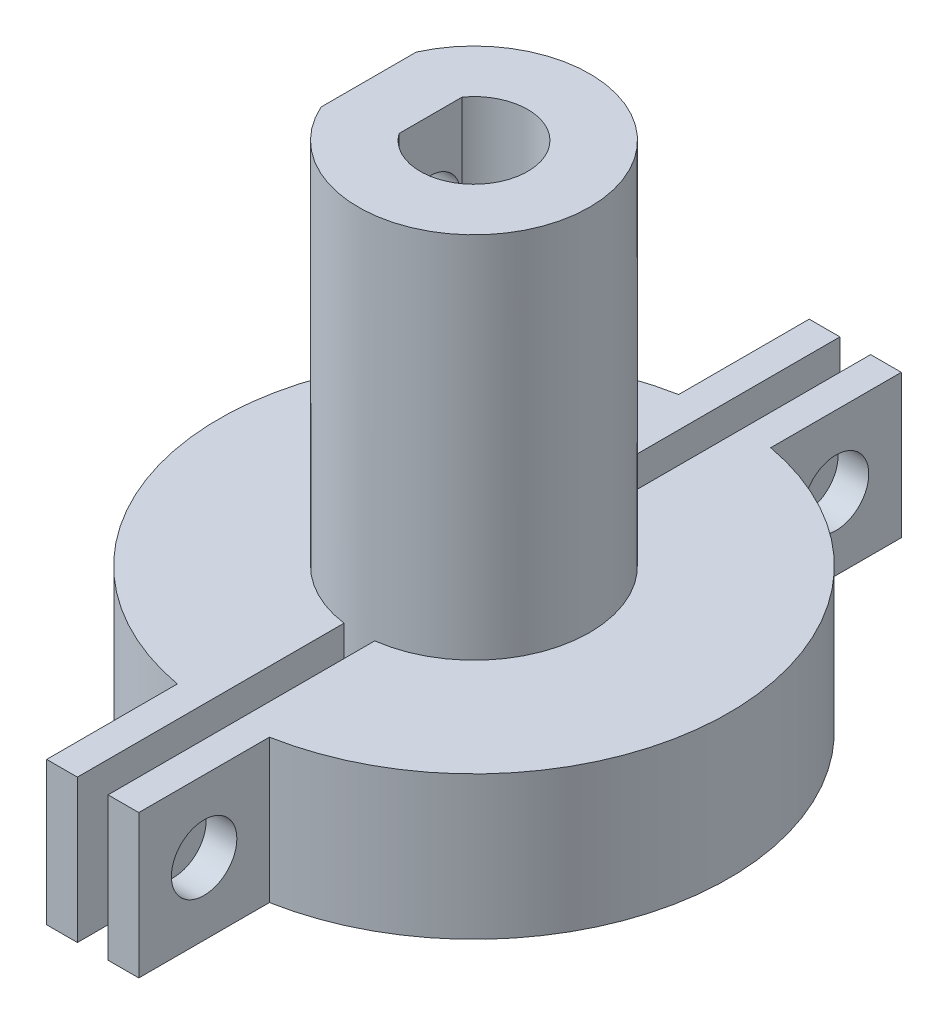
ISO-10303-21;
HEADER;
FILE_DESCRIPTION(('STEP AP214'),'2;1');
FILE_NAME('part.step','',(''),(''),'','','');
FILE_SCHEMA(('AUTOMOTIVE_DESIGN { 1 0 10303 214 1 1 1 1 }'));
ENDSEC;
DATA;
#1=APPLICATION_CONTEXT('core data for automotive mechanical design processes');
#2=APPLICATION_PROTOCOL_DEFINITION('international standard','automotive_design',2000,#1);
#3=PRODUCT_CONTEXT('',#1,'mechanical');
#4=PRODUCT('Part','Part','',(#3));
#5=PRODUCT_RELATED_PRODUCT_CATEGORY('part','',(#4));
#6=PRODUCT_DEFINITION_FORMATION('','',#4);
#7=PRODUCT_DEFINITION_CONTEXT('part definition',#1,'design');
#8=PRODUCT_DEFINITION('design','',#6,#7);
#9=PRODUCT_DEFINITION_SHAPE('','',#8);
#10=(LENGTH_UNIT() NAMED_UNIT(*) SI_UNIT(.MILLI.,.METRE.));
#11=(NAMED_UNIT(*) PLANE_ANGLE_UNIT() SI_UNIT($,.RADIAN.));
#12=(NAMED_UNIT(*) SI_UNIT($,.STERADIAN.) SOLID_ANGLE_UNIT());
#13=UNCERTAINTY_MEASURE_WITH_UNIT(LENGTH_MEASURE(1.E-05),#10,'distance_accuracy_value','');
#14=(GEOMETRIC_REPRESENTATION_CONTEXT(3) GLOBAL_UNCERTAINTY_ASSIGNED_CONTEXT((#13)) GLOBAL_UNIT_ASSIGNED_CONTEXT((#10,
#11,#12)) REPRESENTATION_CONTEXT('',''));
#15=CARTESIAN_POINT('',(0.,0.,0.));
#16=DIRECTION('',(0.,0.,1.));
#17=DIRECTION('',(1.,0.,0.));
#18=AXIS2_PLACEMENT_3D('',#15,#16,#17);
#19=CARTESIAN_POINT('',(0.,0.,0.));
#20=DIRECTION('',(0.,-1.,0.));
#21=DIRECTION('',(0.,0.,-1.));
#22=AXIS2_PLACEMENT_3D('',#19,#20,#21);
#23=PLANE('',#22);
#24=CARTESIAN_POINT('',(0.,0.,0.));
#25=DIRECTION('',(0.,1.,0.));
#26=DIRECTION('',(0.,0.,1.));
#27=AXIS2_PLACEMENT_3D('',#24,#25,#26);
#28=CIRCLE('',#27,5.65);
#29=CARTESIAN_POINT('',(-0.750000000000004,0.,-5.6));
#30=VERTEX_POINT('',#29);
#31=CARTESIAN_POINT('',(-5.14941852602047,0.,-2.32507824467849));
#32=VERTEX_POINT('',#31);
#33=EDGE_CURVE('E237',#30,#32,#28,.T.);
#34=ORIENTED_EDGE('',*,*,#33,.F.);
#35=DIRECTION('',(0.,0.,1.));
#36=VECTOR('',#35,1.);
#37=CARTESIAN_POINT('',(-0.75,0.,-9.42019108086455));
#38=LINE('',#37,#36);
#39=CARTESIAN_POINT('',(-0.75,0.,-18.6273891063248));
#40=VERTEX_POINT('',#39);
#41=EDGE_CURVE('E467',#40,#30,#38,.T.);
#42=ORIENTED_EDGE('',*,*,#41,.F.);
#43=DIRECTION('',(-1.,0.,0.));
#44=VECTOR('',#43,1.);
#45=CARTESIAN_POINT('',(-0.75,0.,-18.6273891063248));
#46=LINE('',#45,#44);
#47=CARTESIAN_POINT('',(-2.25,0.,-18.6273891063248));
#48=VERTEX_POINT('',#47);
#49=EDGE_CURVE('E397',#40,#48,#46,.T.);
#50=ORIENTED_EDGE('',*,*,#49,.T.);
#51=DIRECTION('',(0.,0.,1.));
#52=VECTOR('',#51,1.);
#53=CARTESIAN_POINT('',(-2.25,0.,-18.6273891063248));
#54=LINE('',#53,#52);
#55=CARTESIAN_POINT('',(-2.25,0.,-12.2449989791751));
#56=VERTEX_POINT('',#55);
#57=EDGE_CURVE('E390',#48,#56,#54,.T.);
#58=ORIENTED_EDGE('',*,*,#57,.T.);
#59=CARTESIAN_POINT('',(0.,0.,0.));
#60=DIRECTION('',(0.,-1.,0.));
#61=DIRECTION('',(0.,0.,-1.));
#62=AXIS2_PLACEMENT_3D('',#59,#60,#61);
#63=CIRCLE('',#62,12.45);
#64=CARTESIAN_POINT('',(-2.25,0.,12.2449989791751));
#65=VERTEX_POINT('',#64);
#66=EDGE_CURVE('E65',#65,#56,#63,.T.);
#67=ORIENTED_EDGE('',*,*,#66,.F.);
#68=DIRECTION('',(0.,0.,1.));
#69=VECTOR('',#68,1.);
#70=CARTESIAN_POINT('',(-2.25,0.,18.6273891063248));
#71=LINE('',#70,#69);
#72=CARTESIAN_POINT('',(-2.25,0.,18.6273891063248));
#73=VERTEX_POINT('',#72);
#74=EDGE_CURVE('E447',#65,#73,#71,.T.);
#75=ORIENTED_EDGE('',*,*,#74,.T.);
#76=DIRECTION('',(1.,0.,0.));
#77=VECTOR('',#76,1.);
#78=CARTESIAN_POINT('',(-0.75,0.,18.6273891063248));
#79=LINE('',#78,#77);
#80=CARTESIAN_POINT('',(-0.75,0.,18.6273891063248));
#81=VERTEX_POINT('',#80);
#82=EDGE_CURVE('E444',#73,#81,#79,.T.);
#83=ORIENTED_EDGE('',*,*,#82,.T.);
#84=DIRECTION('',(0.,0.,1.));
#85=VECTOR('',#84,1.);
#86=CARTESIAN_POINT('',(-0.75,0.,9.42019108086455));
#87=LINE('',#86,#85);
#88=CARTESIAN_POINT('',(-0.749999999999999,0.,5.6));
#89=VERTEX_POINT('',#88);
#90=EDGE_CURVE('E328',#89,#81,#87,.T.);
#91=ORIENTED_EDGE('',*,*,#90,.F.);
#92=CARTESIAN_POINT('',(-5.14941852602047,0.,2.32507824467849));
#93=VERTEX_POINT('',#92);
#94=EDGE_CURVE('E236',#93,#89,#28,.T.);
#95=ORIENTED_EDGE('',*,*,#94,.F.);
#96=DIRECTION('',(0.,0.,1.));
#97=VECTOR('',#96,1.);
#98=CARTESIAN_POINT('',(-5.14941852602047,0.,-2.32507824467849));
#99=LINE('',#98,#97);
#100=EDGE_CURVE('E241',#32,#93,#99,.T.);
#101=ORIENTED_EDGE('',*,*,#100,.F.);
#102=EDGE_LOOP('',(#34,#42,#50,#58,#67,#75,#83,#91,#95,#101));
#103=FACE_BOUND('',#102,.T.);
#104=ADVANCED_FACE('F44',(#103),#23,.F.);
#105=CARTESIAN_POINT('',(0.,-2.,0.));
#106=DIRECTION('',(0.,1.,0.));
#107=DIRECTION('',(0.,0.,1.));
#108=AXIS2_PLACEMENT_3D('',#105,#106,#107);
#109=CYLINDRICAL_SURFACE('',#108,12.45);
#110=ORIENTED_EDGE('',*,*,#66,.T.);
#111=DIRECTION('',(0.,-1.,0.));
#112=VECTOR('',#111,1.);
#113=CARTESIAN_POINT('',(-2.25,6.55628734385074,-12.2449989791751));
#114=LINE('',#113,#112);
#115=CARTESIAN_POINT('',(-2.25,-7.,-12.2449989791751));
#116=VERTEX_POINT('',#115);
#117=EDGE_CURVE('E60',#56,#116,#114,.T.);
#118=ORIENTED_EDGE('',*,*,#117,.T.);
#119=CARTESIAN_POINT('',(0.,-7.,0.));
#120=DIRECTION('',(0.,-1.,0.));
#121=DIRECTION('',(0.,0.,-1.));
#122=AXIS2_PLACEMENT_3D('',#119,#120,#121);
#123=CIRCLE('',#122,12.45);
#124=CARTESIAN_POINT('',(-2.25,-7.,12.2449989791751));
#125=VERTEX_POINT('',#124);
#126=EDGE_CURVE('E517',#125,#116,#123,.T.);
#127=ORIENTED_EDGE('',*,*,#126,.F.);
#128=DIRECTION('',(0.,-1.,0.));
#129=VECTOR('',#128,1.);
#130=CARTESIAN_POINT('',(-2.25,6.55628734385074,12.2449989791751));
#131=LINE('',#130,#129);
#132=EDGE_CURVE('E448',#65,#125,#131,.T.);
#133=ORIENTED_EDGE('',*,*,#132,.F.);
#134=EDGE_LOOP('',(#110,#118,#127,#133));
#135=FACE_BOUND('',#134,.T.);
#136=ADVANCED_FACE('F585',(#135),#109,.T.);
#137=CARTESIAN_POINT('',(0.,-7.,0.));
#138=DIRECTION('',(0.,-1.,0.));
#139=DIRECTION('',(0.,0.,-1.));
#140=AXIS2_PLACEMENT_3D('',#137,#138,#139);
#141=PLANE('',#140);
#142=DIRECTION('',(0.,0.,-1.));
#143=VECTOR('',#142,1.);
#144=CARTESIAN_POINT('',(-0.75,-7.,-9.42019108086455));
#145=LINE('',#144,#143);
#146=CARTESIAN_POINT('',(-0.750000000000005,-7.,-9.42019108086455));
#147=VERTEX_POINT('',#146);
#148=CARTESIAN_POINT('',(-0.75,-7.,-18.6273891063248));
#149=VERTEX_POINT('',#148);
#150=EDGE_CURVE('E474',#147,#149,#145,.T.);
#151=ORIENTED_EDGE('',*,*,#150,.F.);
#152=CARTESIAN_POINT('',(0.,-7.,0.));
#153=DIRECTION('',(0.,-1.,0.));
#154=DIRECTION('',(0.,0.,-1.));
#155=AXIS2_PLACEMENT_3D('',#152,#153,#154);
#156=CIRCLE('',#155,9.45);
#157=CARTESIAN_POINT('',(-0.749999999999998,-7.,9.42019108086455));
#158=VERTEX_POINT('',#157);
#159=EDGE_CURVE('E503',#158,#147,#156,.T.);
#160=ORIENTED_EDGE('',*,*,#159,.F.);
#161=DIRECTION('',(0.,0.,-1.));
#162=VECTOR('',#161,1.);
#163=CARTESIAN_POINT('',(-0.75,-7.,9.42019108086455));
#164=LINE('',#163,#162);
#165=CARTESIAN_POINT('',(-0.75,-7.,18.6273891063248));
#166=VERTEX_POINT('',#165);
#167=EDGE_CURVE('E494',#166,#158,#164,.T.);
#168=ORIENTED_EDGE('',*,*,#167,.F.);
#169=DIRECTION('',(-1.,0.,0.));
#170=VECTOR('',#169,1.);
#171=CARTESIAN_POINT('',(-0.75,-7.,18.6273891063248));
#172=LINE('',#171,#170);
#173=CARTESIAN_POINT('',(-2.25,-7.,18.6273891063248));
#174=VERTEX_POINT('',#173);
#175=EDGE_CURVE('E441',#166,#174,#172,.T.);
#176=ORIENTED_EDGE('',*,*,#175,.T.);
#177=DIRECTION('',(0.,0.,-1.));
#178=VECTOR('',#177,1.);
#179=CARTESIAN_POINT('',(-2.25,-7.,18.6273891063248));
#180=LINE('',#179,#178);
#181=EDGE_CURVE('E454',#174,#125,#180,.T.);
#182=ORIENTED_EDGE('',*,*,#181,.T.);
#183=ORIENTED_EDGE('',*,*,#126,.T.);
#184=DIRECTION('',(0.,0.,-1.));
#185=VECTOR('',#184,1.);
#186=CARTESIAN_POINT('',(-2.25,-7.,-18.6273891063248));
#187=LINE('',#186,#185);
#188=CARTESIAN_POINT('',(-2.25,-7.,-18.6273891063248));
#189=VERTEX_POINT('',#188);
#190=EDGE_CURVE('E411',#116,#189,#187,.T.);
#191=ORIENTED_EDGE('',*,*,#190,.T.);
#192=DIRECTION('',(1.,0.,0.));
#193=VECTOR('',#192,1.);
#194=CARTESIAN_POINT('',(-0.75,-7.,-18.6273891063248));
#195=LINE('',#194,#193);
#196=EDGE_CURVE('E400',#189,#149,#195,.T.);
#197=ORIENTED_EDGE('',*,*,#196,.T.);
#198=EDGE_LOOP('',(#151,#160,#168,#176,#182,#183,#191,#197));
#199=FACE_BOUND('',#198,.T.);
#200=ADVANCED_FACE('F527',(#199),#141,.T.);
#201=CARTESIAN_POINT('',(0.,-7.,0.));
#202=DIRECTION('',(0.,1.,0.));
#203=DIRECTION('',(0.,0.,1.));
#204=AXIS2_PLACEMENT_3D('',#201,#202,#203);
#205=CYLINDRICAL_SURFACE('',#204,9.45);
#206=DIRECTION('',(0.,-1.,0.));
#207=VECTOR('',#206,1.);
#208=CARTESIAN_POINT('',(-0.750000000000005,18.001,-9.42019108086455));
#209=LINE('',#208,#207);
#210=CARTESIAN_POINT('',(-0.750000000000005,-2.,-9.42019108086455));
#211=VERTEX_POINT('',#210);
#212=EDGE_CURVE('E218',#211,#147,#209,.T.);
#213=ORIENTED_EDGE('',*,*,#212,.F.);
#214=CARTESIAN_POINT('',(0.,-2.,0.));
#215=DIRECTION('',(0.,-1.,0.));
#216=DIRECTION('',(0.,0.,-1.));
#217=AXIS2_PLACEMENT_3D('',#214,#215,#216);
#218=CIRCLE('',#217,9.45);
#219=CARTESIAN_POINT('',(-0.749999999999998,-2.,9.42019108086455));
#220=VERTEX_POINT('',#219);
#221=EDGE_CURVE('E272',#211,#220,#218,.F.);
#222=ORIENTED_EDGE('',*,*,#221,.T.);
#223=DIRECTION('',(0.,-1.,0.));
#224=VECTOR('',#223,1.);
#225=CARTESIAN_POINT('',(-0.749999999999998,18.001,9.42019108086455));
#226=LINE('',#225,#224);
#227=EDGE_CURVE('E486',#220,#158,#226,.T.);
#228=ORIENTED_EDGE('',*,*,#227,.T.);
#229=ORIENTED_EDGE('',*,*,#159,.T.);
#230=EDGE_LOOP('',(#213,#222,#228,#229));
#231=FACE_BOUND('',#230,.T.);
#232=ADVANCED_FACE('F524',(#231),#205,.F.);
#233=CARTESIAN_POINT('',(0.,18.,0.));
#234=DIRECTION('',(0.,1.,0.));
#235=DIRECTION('',(0.,0.,1.));
#236=AXIS2_PLACEMENT_3D('',#233,#234,#235);
#237=PLANE('',#236);
#238=CARTESIAN_POINT('',(0.,18.,0.));
#239=DIRECTION('',(0.,1.,0.));
#240=DIRECTION('',(0.,0.,1.));
#241=AXIS2_PLACEMENT_3D('',#238,#239,#240);
#242=CIRCLE('',#241,5.65);
#243=CARTESIAN_POINT('',(-5.14941852602047,18.,2.32507824467849));
#244=VERTEX_POINT('',#243);
#245=CARTESIAN_POINT('',(-5.14941852602047,18.,-2.32507824467849));
#246=VERTEX_POINT('',#245);
#247=EDGE_CURVE('E250',#244,#246,#242,.T.);
#248=ORIENTED_EDGE('',*,*,#247,.T.);
#249=DIRECTION('',(0.,0.,1.));
#250=VECTOR('',#249,1.);
#251=CARTESIAN_POINT('',(-5.14941852602047,18.,-2.32507824467849));
#252=LINE('',#251,#250);
#253=EDGE_CURVE('E245',#246,#244,#252,.T.);
#254=ORIENTED_EDGE('',*,*,#253,.T.);
#255=EDGE_LOOP('',(#248,#254));
#256=FACE_BOUND('',#255,.T.);
#257=DIRECTION('',(0.,0.,1.));
#258=VECTOR('',#257,1.);
#259=CARTESIAN_POINT('',(-2.12441852602047,18.,-1.54190496668926));
#260=LINE('',#259,#258);
#261=CARTESIAN_POINT('',(-2.12441852602047,18.,-1.54190496668926));
#262=VERTEX_POINT('',#261);
#263=CARTESIAN_POINT('',(-2.12441852602047,18.,1.54190496668926));
#264=VERTEX_POINT('',#263);
#265=EDGE_CURVE('E296',#262,#264,#260,.T.);
#266=ORIENTED_EDGE('',*,*,#265,.F.);
#267=CARTESIAN_POINT('',(0.,18.,0.));
#268=DIRECTION('',(0.,1.,0.));
#269=DIRECTION('',(0.,0.,1.));
#270=AXIS2_PLACEMENT_3D('',#267,#268,#269);
#271=CIRCLE('',#270,2.625);
#272=EDGE_CURVE('E292',#264,#262,#271,.T.);
#273=ORIENTED_EDGE('',*,*,#272,.F.);
#274=EDGE_LOOP('',(#266,#273));
#275=FACE_BOUND('',#274,.T.);
#276=ADVANCED_FACE('F318',(#256,#275),#237,.T.);
#277=CARTESIAN_POINT('',(0.,18.,0.));
#278=DIRECTION('',(0.,-1.,0.));
#279=DIRECTION('',(0.,0.,-1.));
#280=AXIS2_PLACEMENT_3D('',#277,#278,#279);
#281=CYLINDRICAL_SURFACE('',#280,5.65);
#282=ORIENTED_EDGE('',*,*,#94,.T.);
#283=DIRECTION('',(0.,1.,0.));
#284=VECTOR('',#283,1.);
#285=CARTESIAN_POINT('',(-0.749999999999999,-7.,5.6));
#286=LINE('',#285,#284);
#287=CARTESIAN_POINT('',(-0.749999999999999,-2.,5.6));
#288=VERTEX_POINT('',#287);
#289=EDGE_CURVE('E229',#288,#89,#286,.T.);
#290=ORIENTED_EDGE('',*,*,#289,.F.);
#291=CARTESIAN_POINT('',(0.,-2.,0.));
#292=DIRECTION('',(0.,-1.,0.));
#293=DIRECTION('',(0.,0.,-1.));
#294=AXIS2_PLACEMENT_3D('',#291,#292,#293);
#295=CIRCLE('',#294,5.65);
#296=CARTESIAN_POINT('',(0.75,-2.,5.6));
#297=VERTEX_POINT('',#296);
#298=EDGE_CURVE('E53',#288,#297,#295,.F.);
#299=ORIENTED_EDGE('',*,*,#298,.T.);
#300=DIRECTION('',(0.,1.,0.));
#301=VECTOR('',#300,1.);
#302=CARTESIAN_POINT('',(0.75,-7.,5.6));
#303=LINE('',#302,#301);
#304=CARTESIAN_POINT('',(0.75,0.,5.6));
#305=VERTEX_POINT('',#304);
#306=EDGE_CURVE('E234',#297,#305,#303,.T.);
#307=ORIENTED_EDGE('',*,*,#306,.T.);
#308=CARTESIAN_POINT('',(0.75,0.,-5.6));
#309=VERTEX_POINT('',#308);
#310=EDGE_CURVE('E210',#305,#309,#28,.T.);
#311=ORIENTED_EDGE('',*,*,#310,.T.);
#312=DIRECTION('',(0.,1.,0.));
#313=VECTOR('',#312,1.);
#314=CARTESIAN_POINT('',(0.75,-7.,-5.6));
#315=LINE('',#314,#313);
#316=CARTESIAN_POINT('',(0.75,-2.,-5.6));
#317=VERTEX_POINT('',#316);
#318=EDGE_CURVE('E221',#317,#309,#315,.T.);
#319=ORIENTED_EDGE('',*,*,#318,.F.);
#320=CARTESIAN_POINT('',(0.,-2.,0.));
#321=DIRECTION('',(0.,-1.,0.));
#322=DIRECTION('',(0.,0.,-1.));
#323=AXIS2_PLACEMENT_3D('',#320,#321,#322);
#324=CIRCLE('',#323,5.65);
#325=CARTESIAN_POINT('',(-0.750000000000004,-2.,-5.6));
#326=VERTEX_POINT('',#325);
#327=EDGE_CURVE('E11',#317,#326,#324,.F.);
#328=ORIENTED_EDGE('',*,*,#327,.T.);
#329=DIRECTION('',(0.,1.,0.));
#330=VECTOR('',#329,1.);
#331=CARTESIAN_POINT('',(-0.750000000000004,-7.,-5.6));
#332=LINE('',#331,#330);
#333=EDGE_CURVE('E228',#326,#30,#332,.T.);
#334=ORIENTED_EDGE('',*,*,#333,.T.);
#335=ORIENTED_EDGE('',*,*,#33,.T.);
#336=DIRECTION('',(0.,-1.,0.));
#337=VECTOR('',#336,1.);
#338=CARTESIAN_POINT('',(-5.14941852602047,18.,-2.32507824467849));
#339=LINE('',#338,#337);
#340=EDGE_CURVE('E255',#246,#32,#339,.T.);
#341=ORIENTED_EDGE('',*,*,#340,.F.);
#342=ORIENTED_EDGE('',*,*,#247,.F.);
#343=DIRECTION('',(0.,-1.,0.));
#344=VECTOR('',#343,1.);
#345=CARTESIAN_POINT('',(-5.14941852602047,18.,2.32507824467849));
#346=LINE('',#345,#344);
#347=EDGE_CURVE('E251',#244,#93,#346,.T.);
#348=ORIENTED_EDGE('',*,*,#347,.T.);
#349=EDGE_LOOP('',(#282,#290,#299,#307,#311,#319,#328,#334,#335,#341,#342,#348));
#350=FACE_BOUND('',#349,.T.);
#351=ADVANCED_FACE('F46',(#350),#281,.T.);
#352=CARTESIAN_POINT('',(-5.14941852602047,18.,-2.32507824467849));
#353=DIRECTION('',(1.,0.,0.));
#354=DIRECTION('',(0.,0.,-1.));
#355=AXIS2_PLACEMENT_3D('',#352,#353,#354);
#356=PLANE('',#355);
#357=CARTESIAN_POINT('',(-5.14941852602047,14.,0.));
#358=DIRECTION('',(-1.,0.,0.));
#359=DIRECTION('',(0.,0.,1.));
#360=AXIS2_PLACEMENT_3D('',#357,#358,#359);
#361=CIRCLE('',#360,1.45);
#362=CARTESIAN_POINT('',(-5.14941852602047,14.,1.45));
#363=VERTEX_POINT('',#362);
#364=EDGE_CURVE('E499',#363,#363,#361,.T.);
#365=ORIENTED_EDGE('',*,*,#364,.F.);
#366=EDGE_LOOP('',(#365));
#367=FACE_BOUND('',#366,.T.);
#368=CARTESIAN_POINT('',(-5.14941852602047,4.,0.));
#369=DIRECTION('',(-1.,0.,0.));
#370=DIRECTION('',(0.,0.,1.));
#371=AXIS2_PLACEMENT_3D('',#368,#369,#370);
#372=CIRCLE('',#371,1.45);
#373=CARTESIAN_POINT('',(-5.14941852602047,4.,1.45));
#374=VERTEX_POINT('',#373);
#375=EDGE_CURVE('E217',#374,#374,#372,.T.);
#376=ORIENTED_EDGE('',*,*,#375,.F.);
#377=EDGE_LOOP('',(#376));
#378=FACE_BOUND('',#377,.T.);
#379=ORIENTED_EDGE('',*,*,#100,.T.);
#380=ORIENTED_EDGE('',*,*,#347,.F.);
#381=ORIENTED_EDGE('',*,*,#253,.F.);
#382=ORIENTED_EDGE('',*,*,#340,.T.);
#383=EDGE_LOOP('',(#379,#380,#381,#382));
#384=FACE_BOUND('',#383,.T.);
#385=ADVANCED_FACE('F321',(#367,#378,#384),#356,.F.);
#386=CARTESIAN_POINT('',(0.,18.,0.));
#387=DIRECTION('',(0.,-1.,0.));
#388=DIRECTION('',(0.,0.,-1.));
#389=AXIS2_PLACEMENT_3D('',#386,#387,#388);
#390=CYLINDRICAL_SURFACE('',#389,2.625);
#391=CARTESIAN_POINT('',(0.,0.,0.));
#392=DIRECTION('',(0.,1.,0.));
#393=DIRECTION('',(0.,0.,1.));
#394=AXIS2_PLACEMENT_3D('',#391,#392,#393);
#395=CIRCLE('',#394,2.625);
#396=CARTESIAN_POINT('',(-2.12441852602047,0.,1.54190496668926));
#397=VERTEX_POINT('',#396);
#398=CARTESIAN_POINT('',(-2.12441852602047,0.,-1.54190496668926));
#399=VERTEX_POINT('',#398);
#400=EDGE_CURVE('E291',#397,#399,#395,.T.);
#401=ORIENTED_EDGE('',*,*,#400,.F.);
#402=DIRECTION('',(0.,-1.,0.));
#403=VECTOR('',#402,1.);
#404=CARTESIAN_POINT('',(-2.12441852602047,18.,1.54190496668926));
#405=LINE('',#404,#403);
#406=EDGE_CURVE('E300',#264,#397,#405,.T.);
#407=ORIENTED_EDGE('',*,*,#406,.F.);
#408=ORIENTED_EDGE('',*,*,#272,.T.);
#409=DIRECTION('',(0.,-1.,0.));
#410=VECTOR('',#409,1.);
#411=CARTESIAN_POINT('',(-2.12441852602047,18.,-1.54190496668926));
#412=LINE('',#411,#410);
#413=EDGE_CURVE('E242',#262,#399,#412,.T.);
#414=ORIENTED_EDGE('',*,*,#413,.T.);
#415=EDGE_LOOP('',(#401,#407,#408,#414));
#416=FACE_BOUND('',#415,.T.);
#417=ADVANCED_FACE('F612',(#416),#390,.F.);
#418=CARTESIAN_POINT('',(-2.12441852602047,18.,-1.54190496668926));
#419=DIRECTION('',(1.,0.,0.));
#420=DIRECTION('',(0.,0.,-1.));
#421=AXIS2_PLACEMENT_3D('',#418,#419,#420);
#422=PLANE('',#421);
#423=CARTESIAN_POINT('',(-2.12441852602047,14.,0.));
#424=DIRECTION('',(1.,0.,0.));
#425=DIRECTION('',(0.,0.,-1.));
#426=AXIS2_PLACEMENT_3D('',#423,#424,#425);
#427=CIRCLE('',#426,1.45);
#428=CARTESIAN_POINT('',(-2.12441852602047,14.,-1.45));
#429=VERTEX_POINT('',#428);
#430=EDGE_CURVE('E504',#429,#429,#427,.F.);
#431=ORIENTED_EDGE('',*,*,#430,.T.);
#432=EDGE_LOOP('',(#431));
#433=FACE_BOUND('',#432,.T.);
#434=CARTESIAN_POINT('',(-2.12441852602047,4.,0.));
#435=DIRECTION('',(1.,0.,0.));
#436=DIRECTION('',(0.,0.,-1.));
#437=AXIS2_PLACEMENT_3D('',#434,#435,#436);
#438=CIRCLE('',#437,1.45);
#439=CARTESIAN_POINT('',(-2.12441852602047,4.,-1.45));
#440=VERTEX_POINT('',#439);
#441=EDGE_CURVE('E508',#440,#440,#438,.F.);
#442=ORIENTED_EDGE('',*,*,#441,.T.);
#443=EDGE_LOOP('',(#442));
#444=FACE_BOUND('',#443,.T.);
#445=DIRECTION('',(0.,0.,1.));
#446=VECTOR('',#445,1.);
#447=CARTESIAN_POINT('',(-2.12441852602047,0.,-1.54190496668926));
#448=LINE('',#447,#446);
#449=EDGE_CURVE('E297',#399,#397,#448,.T.);
#450=ORIENTED_EDGE('',*,*,#449,.F.);
#451=ORIENTED_EDGE('',*,*,#413,.F.);
#452=ORIENTED_EDGE('',*,*,#265,.T.);
#453=ORIENTED_EDGE('',*,*,#406,.T.);
#454=EDGE_LOOP('',(#450,#451,#452,#453));
#455=FACE_BOUND('',#454,.T.);
#456=ADVANCED_FACE('F596',(#433,#444,#455),#422,.T.);
#457=ORIENTED_EDGE('',*,*,#449,.T.);
#458=ORIENTED_EDGE('',*,*,#400,.T.);
#459=EDGE_LOOP('',(#457,#458));
#460=FACE_BOUND('',#459,.T.);
#461=ADVANCED_FACE('F587',(#460),#23,.F.);
#462=CARTESIAN_POINT('',(2.25000000000001,-7.,-12.2449989791751));
#463=VERTEX_POINT('',#462);
#464=CARTESIAN_POINT('',(2.25000000000001,-7.,12.2449989791751));
#465=VERTEX_POINT('',#464);
#466=EDGE_CURVE('E286',#463,#465,#123,.T.);
#467=ORIENTED_EDGE('',*,*,#466,.F.);
#468=DIRECTION('',(0.,-1.,0.));
#469=VECTOR('',#468,1.);
#470=CARTESIAN_POINT('',(2.25000000000001,6.55628734385074,-12.2449989791751));
#471=LINE('',#470,#469);
#472=CARTESIAN_POINT('',(2.25000000000001,0.,-12.2449989791751));
#473=VERTEX_POINT('',#472);
#474=EDGE_CURVE('E380',#473,#463,#471,.T.);
#475=ORIENTED_EDGE('',*,*,#474,.F.);
#476=CARTESIAN_POINT('',(2.25000000000001,0.,12.2449989791751));
#477=VERTEX_POINT('',#476);
#478=EDGE_CURVE('E288',#473,#477,#63,.T.);
#479=ORIENTED_EDGE('',*,*,#478,.T.);
#480=DIRECTION('',(0.,-1.,0.));
#481=VECTOR('',#480,1.);
#482=CARTESIAN_POINT('',(2.25000000000001,6.55628734385074,12.2449989791751));
#483=LINE('',#482,#481);
#484=EDGE_CURVE('E422',#477,#465,#483,.T.);
#485=ORIENTED_EDGE('',*,*,#484,.T.);
#486=EDGE_LOOP('',(#467,#475,#479,#485));
#487=FACE_BOUND('',#486,.T.);
#488=ADVANCED_FACE('F559',(#487),#109,.T.);
#489=DIRECTION('',(0.,0.,-1.));
#490=VECTOR('',#489,1.);
#491=CARTESIAN_POINT('',(0.75,0.,-9.42019108086455));
#492=LINE('',#491,#490);
#493=CARTESIAN_POINT('',(0.75000000000001,0.,-18.6273891063248));
#494=VERTEX_POINT('',#493);
#495=EDGE_CURVE('E206',#309,#494,#492,.T.);
#496=ORIENTED_EDGE('',*,*,#495,.F.);
#497=ORIENTED_EDGE('',*,*,#310,.F.);
#498=DIRECTION('',(0.,0.,-1.));
#499=VECTOR('',#498,1.);
#500=CARTESIAN_POINT('',(0.75,0.,9.42019108086455));
#501=LINE('',#500,#499);
#502=CARTESIAN_POINT('',(0.75000000000001,0.,18.6273891063248));
#503=VERTEX_POINT('',#502);
#504=EDGE_CURVE('E471',#503,#305,#501,.T.);
#505=ORIENTED_EDGE('',*,*,#504,.F.);
#506=DIRECTION('',(1.,0.,0.));
#507=VECTOR('',#506,1.);
#508=CARTESIAN_POINT('',(0.75000000000001,0.,18.6273891063248));
#509=LINE('',#508,#507);
#510=CARTESIAN_POINT('',(2.25000000000001,0.,18.6273891063248));
#511=VERTEX_POINT('',#510);
#512=EDGE_CURVE('E421',#503,#511,#509,.T.);
#513=ORIENTED_EDGE('',*,*,#512,.T.);
#514=DIRECTION('',(0.,0.,-1.));
#515=VECTOR('',#514,1.);
#516=CARTESIAN_POINT('',(2.25000000000001,0.,18.6273891063248));
#517=LINE('',#516,#515);
#518=EDGE_CURVE('E415',#511,#477,#517,.T.);
#519=ORIENTED_EDGE('',*,*,#518,.T.);
#520=ORIENTED_EDGE('',*,*,#478,.F.);
#521=DIRECTION('',(0.,0.,-1.));
#522=VECTOR('',#521,1.);
#523=CARTESIAN_POINT('',(2.25000000000001,0.,-18.6273891063248));
#524=LINE('',#523,#522);
#525=CARTESIAN_POINT('',(2.25000000000001,0.,-18.6273891063248));
#526=VERTEX_POINT('',#525);
#527=EDGE_CURVE('E372',#473,#526,#524,.T.);
#528=ORIENTED_EDGE('',*,*,#527,.T.);
#529=DIRECTION('',(-1.,0.,0.));
#530=VECTOR('',#529,1.);
#531=CARTESIAN_POINT('',(0.75000000000001,0.,-18.6273891063248));
#532=LINE('',#531,#530);
#533=EDGE_CURVE('E212',#526,#494,#532,.T.);
#534=ORIENTED_EDGE('',*,*,#533,.T.);
#535=EDGE_LOOP('',(#496,#497,#505,#513,#519,#520,#528,#534));
#536=FACE_BOUND('',#535,.T.);
#537=ADVANCED_FACE('F208',(#536),#23,.F.);
#538=DIRECTION('',(0.,0.,1.));
#539=VECTOR('',#538,1.);
#540=CARTESIAN_POINT('',(0.75,-7.,-9.42019108086455));
#541=LINE('',#540,#539);
#542=CARTESIAN_POINT('',(0.75000000000001,-7.,-18.6273891063248));
#543=VERTEX_POINT('',#542);
#544=CARTESIAN_POINT('',(0.75,-7.,-9.42019108086455));
#545=VERTEX_POINT('',#544);
#546=EDGE_CURVE('E470',#543,#545,#541,.T.);
#547=ORIENTED_EDGE('',*,*,#546,.F.);
#548=DIRECTION('',(1.,0.,0.));
#549=VECTOR('',#548,1.);
#550=CARTESIAN_POINT('',(0.75000000000001,-7.,-18.6273891063248));
#551=LINE('',#550,#549);
#552=CARTESIAN_POINT('',(2.25000000000001,-7.,-18.6273891063248));
#553=VERTEX_POINT('',#552);
#554=EDGE_CURVE('E386',#543,#553,#551,.T.);
#555=ORIENTED_EDGE('',*,*,#554,.T.);
#556=DIRECTION('',(0.,0.,1.));
#557=VECTOR('',#556,1.);
#558=CARTESIAN_POINT('',(2.25000000000001,-7.,-18.6273891063248));
#559=LINE('',#558,#557);
#560=EDGE_CURVE('E376',#553,#463,#559,.T.);
#561=ORIENTED_EDGE('',*,*,#560,.T.);
#562=ORIENTED_EDGE('',*,*,#466,.T.);
#563=DIRECTION('',(0.,0.,1.));
#564=VECTOR('',#563,1.);
#565=CARTESIAN_POINT('',(2.25000000000001,-7.,18.6273891063248));
#566=LINE('',#565,#564);
#567=CARTESIAN_POINT('',(2.25000000000001,-7.,18.6273891063248));
#568=VERTEX_POINT('',#567);
#569=EDGE_CURVE('E437',#465,#568,#566,.T.);
#570=ORIENTED_EDGE('',*,*,#569,.T.);
#571=DIRECTION('',(-1.,0.,0.));
#572=VECTOR('',#571,1.);
#573=CARTESIAN_POINT('',(0.75000000000001,-7.,18.6273891063248));
#574=LINE('',#573,#572);
#575=CARTESIAN_POINT('',(0.75000000000001,-7.,18.6273891063248));
#576=VERTEX_POINT('',#575);
#577=EDGE_CURVE('E426',#568,#576,#574,.T.);
#578=ORIENTED_EDGE('',*,*,#577,.T.);
#579=DIRECTION('',(0.,0.,1.));
#580=VECTOR('',#579,1.);
#581=CARTESIAN_POINT('',(0.75,-7.,9.42019108086455));
#582=LINE('',#581,#580);
#583=CARTESIAN_POINT('',(0.75,-7.,9.42019108086455));
#584=VERTEX_POINT('',#583);
#585=EDGE_CURVE('E489',#584,#576,#582,.T.);
#586=ORIENTED_EDGE('',*,*,#585,.F.);
#587=EDGE_CURVE('E514',#545,#584,#156,.T.);
#588=ORIENTED_EDGE('',*,*,#587,.F.);
#589=EDGE_LOOP('',(#547,#555,#561,#562,#570,#578,#586,#588));
#590=FACE_BOUND('',#589,.T.);
#591=ADVANCED_FACE('F545',(#590),#141,.T.);
#592=DIRECTION('',(0.,-1.,0.));
#593=VECTOR('',#592,1.);
#594=CARTESIAN_POINT('',(0.75,18.001,-9.42019108086455));
#595=LINE('',#594,#593);
#596=CARTESIAN_POINT('',(0.75,-2.,-9.42019108086455));
#597=VERTEX_POINT('',#596);
#598=EDGE_CURVE('E477',#597,#545,#595,.T.);
#599=ORIENTED_EDGE('',*,*,#598,.T.);
#600=ORIENTED_EDGE('',*,*,#587,.T.);
#601=DIRECTION('',(0.,-1.,0.));
#602=VECTOR('',#601,1.);
#603=CARTESIAN_POINT('',(0.75,18.001,9.42019108086455));
#604=LINE('',#603,#602);
#605=CARTESIAN_POINT('',(0.75,-2.,9.42019108086455));
#606=VERTEX_POINT('',#605);
#607=EDGE_CURVE('E485',#606,#584,#604,.T.);
#608=ORIENTED_EDGE('',*,*,#607,.F.);
#609=EDGE_CURVE('E259',#606,#597,#218,.F.);
#610=ORIENTED_EDGE('',*,*,#609,.T.);
#611=EDGE_LOOP('',(#599,#600,#608,#610));
#612=FACE_BOUND('',#611,.T.);
#613=ADVANCED_FACE('F540',(#612),#205,.F.);
#614=CARTESIAN_POINT('',(0.,-2.,0.));
#615=DIRECTION('',(0.,-1.,0.));
#616=DIRECTION('',(0.,0.,-1.));
#617=AXIS2_PLACEMENT_3D('',#614,#615,#616);
#618=PLANE('',#617);
#619=DIRECTION('',(0.,0.,-1.));
#620=VECTOR('',#619,1.);
#621=CARTESIAN_POINT('',(-0.750000000000001,-2.,0.));
#622=LINE('',#621,#620);
#623=EDGE_CURVE('E344',#326,#211,#622,.T.);
#624=ORIENTED_EDGE('',*,*,#623,.F.);
#625=ORIENTED_EDGE('',*,*,#327,.F.);
#626=DIRECTION('',(0.,0.,1.));
#627=VECTOR('',#626,1.);
#628=CARTESIAN_POINT('',(0.75,-2.,0.));
#629=LINE('',#628,#627);
#630=EDGE_CURVE('E224',#597,#317,#629,.T.);
#631=ORIENTED_EDGE('',*,*,#630,.F.);
#632=ORIENTED_EDGE('',*,*,#609,.F.);
#633=DIRECTION('',(0.,0.,1.));
#634=VECTOR('',#633,1.);
#635=CARTESIAN_POINT('',(0.75,-2.,0.));
#636=LINE('',#635,#634);
#637=EDGE_CURVE('E340',#297,#606,#636,.T.);
#638=ORIENTED_EDGE('',*,*,#637,.F.);
#639=ORIENTED_EDGE('',*,*,#298,.F.);
#640=DIRECTION('',(0.,0.,-1.));
#641=VECTOR('',#640,1.);
#642=CARTESIAN_POINT('',(-0.750000000000001,-2.,0.));
#643=LINE('',#642,#641);
#644=EDGE_CURVE('E337',#220,#288,#643,.T.);
#645=ORIENTED_EDGE('',*,*,#644,.F.);
#646=ORIENTED_EDGE('',*,*,#221,.F.);
#647=EDGE_LOOP('',(#624,#625,#631,#632,#638,#639,#645,#646));
#648=FACE_BOUND('',#647,.T.);
#649=ADVANCED_FACE('F336',(#648),#618,.T.);
#650=CARTESIAN_POINT('',(12.451,4.,0.));
#651=DIRECTION('',(-1.,0.,0.));
#652=DIRECTION('',(0.,0.,1.));
#653=AXIS2_PLACEMENT_3D('',#650,#651,#652);
#654=CYLINDRICAL_SURFACE('',#653,1.45);
#655=ORIENTED_EDGE('',*,*,#441,.F.);
#656=EDGE_LOOP('',(#655));
#657=FACE_BOUND('',#656,.T.);
#658=ORIENTED_EDGE('',*,*,#375,.T.);
#659=EDGE_LOOP('',(#658));
#660=FACE_BOUND('',#659,.T.);
#661=ADVANCED_FACE('F626',(#657,#660),#654,.F.);
#662=CARTESIAN_POINT('',(12.451,14.,0.));
#663=DIRECTION('',(-1.,0.,0.));
#664=DIRECTION('',(0.,0.,1.));
#665=AXIS2_PLACEMENT_3D('',#662,#663,#664);
#666=CYLINDRICAL_SURFACE('',#665,1.45);
#667=ORIENTED_EDGE('',*,*,#430,.F.);
#668=EDGE_LOOP('',(#667));
#669=FACE_BOUND('',#668,.T.);
#670=ORIENTED_EDGE('',*,*,#364,.T.);
#671=EDGE_LOOP('',(#670));
#672=FACE_BOUND('',#671,.T.);
#673=ADVANCED_FACE('F628',(#669,#672),#666,.F.);
#674=CARTESIAN_POINT('',(0.75,18.001,9.42019108086455));
#675=DIRECTION('',(1.,0.,0.));
#676=DIRECTION('',(0.,0.,-1.));
#677=AXIS2_PLACEMENT_3D('',#674,#675,#676);
#678=PLANE('',#677);
#679=CARTESIAN_POINT('',(0.750000000000001,-3.49999999999998,15.43619404275));
#680=DIRECTION('',(1.,0.,0.));
#681=DIRECTION('',(0.,0.,-1.));
#682=AXIS2_PLACEMENT_3D('',#679,#680,#681);
#683=CIRCLE('',#682,1.6);
#684=CARTESIAN_POINT('',(0.750000000000001,-3.49999999999998,13.83619404275));
#685=VERTEX_POINT('',#684);
#686=EDGE_CURVE('E368',#685,#685,#683,.T.);
#687=ORIENTED_EDGE('',*,*,#686,.T.);
#688=EDGE_LOOP('',(#687));
#689=FACE_BOUND('',#688,.T.);
#690=ORIENTED_EDGE('',*,*,#504,.T.);
#691=ORIENTED_EDGE('',*,*,#306,.F.);
#692=ORIENTED_EDGE('',*,*,#637,.T.);
#693=ORIENTED_EDGE('',*,*,#607,.T.);
#694=ORIENTED_EDGE('',*,*,#585,.T.);
#695=DIRECTION('',(0.,-1.,0.));
#696=VECTOR('',#695,1.);
#697=CARTESIAN_POINT('',(0.75000000000001,6.55628734385074,18.6273891063248));
#698=LINE('',#697,#696);
#699=EDGE_CURVE('E430',#503,#576,#698,.T.);
#700=ORIENTED_EDGE('',*,*,#699,.F.);
#701=EDGE_LOOP('',(#690,#691,#692,#693,#694,#700));
#702=FACE_BOUND('',#701,.T.);
#703=ADVANCED_FACE('F542',(#689,#702),#678,.F.);
#704=CARTESIAN_POINT('',(-0.75,18.001,9.42019108086455));
#705=DIRECTION('',(-1.,0.,0.));
#706=DIRECTION('',(0.,0.,1.));
#707=AXIS2_PLACEMENT_3D('',#704,#705,#706);
#708=PLANE('',#707);
#709=CARTESIAN_POINT('',(-0.750000000000001,-3.49999999999998,15.43619404275));
#710=DIRECTION('',(-1.,0.,0.));
#711=DIRECTION('',(0.,0.,1.));
#712=AXIS2_PLACEMENT_3D('',#709,#710,#711);
#713=CIRCLE('',#712,1.6);
#714=CARTESIAN_POINT('',(-0.750000000000001,-3.49999999999998,17.03619404275));
#715=VERTEX_POINT('',#714);
#716=EDGE_CURVE('E269',#715,#715,#713,.T.);
#717=ORIENTED_EDGE('',*,*,#716,.T.);
#718=EDGE_LOOP('',(#717));
#719=FACE_BOUND('',#718,.T.);
#720=ORIENTED_EDGE('',*,*,#90,.T.);
#721=DIRECTION('',(0.,-1.,0.));
#722=VECTOR('',#721,1.);
#723=CARTESIAN_POINT('',(-0.75,6.55628734385074,18.6273891063248));
#724=LINE('',#723,#722);
#725=EDGE_CURVE('E458',#81,#166,#724,.T.);
#726=ORIENTED_EDGE('',*,*,#725,.T.);
#727=ORIENTED_EDGE('',*,*,#167,.T.);
#728=ORIENTED_EDGE('',*,*,#227,.F.);
#729=ORIENTED_EDGE('',*,*,#644,.T.);
#730=ORIENTED_EDGE('',*,*,#289,.T.);
#731=EDGE_LOOP('',(#720,#726,#727,#728,#729,#730));
#732=FACE_BOUND('',#731,.T.);
#733=ADVANCED_FACE('F688',(#719,#732),#708,.F.);
#734=CARTESIAN_POINT('',(-0.75,18.001,-9.42019108086455));
#735=DIRECTION('',(-1.,0.,0.));
#736=DIRECTION('',(0.,0.,1.));
#737=AXIS2_PLACEMENT_3D('',#734,#735,#736);
#738=PLANE('',#737);
#739=CARTESIAN_POINT('',(-0.750000000000001,-3.5,-15.43619404275));
#740=DIRECTION('',(-1.,0.,0.));
#741=DIRECTION('',(0.,0.,1.));
#742=AXIS2_PLACEMENT_3D('',#739,#740,#741);
#743=CIRCLE('',#742,1.6);
#744=CARTESIAN_POINT('',(-0.750000000000001,-3.5,-13.83619404275));
#745=VERTEX_POINT('',#744);
#746=EDGE_CURVE('E270',#745,#745,#743,.T.);
#747=ORIENTED_EDGE('',*,*,#746,.T.);
#748=EDGE_LOOP('',(#747));
#749=FACE_BOUND('',#748,.T.);
#750=ORIENTED_EDGE('',*,*,#41,.T.);
#751=ORIENTED_EDGE('',*,*,#333,.F.);
#752=ORIENTED_EDGE('',*,*,#623,.T.);
#753=ORIENTED_EDGE('',*,*,#212,.T.);
#754=ORIENTED_EDGE('',*,*,#150,.T.);
#755=DIRECTION('',(0.,-1.,0.));
#756=VECTOR('',#755,1.);
#757=CARTESIAN_POINT('',(-0.75,6.55628734385074,-18.6273891063248));
#758=LINE('',#757,#756);
#759=EDGE_CURVE('E404',#40,#149,#758,.T.);
#760=ORIENTED_EDGE('',*,*,#759,.F.);
#761=EDGE_LOOP('',(#750,#751,#752,#753,#754,#760));
#762=FACE_BOUND('',#761,.T.);
#763=ADVANCED_FACE('F531',(#749,#762),#738,.F.);
#764=CARTESIAN_POINT('',(0.75,18.001,-9.42019108086455));
#765=DIRECTION('',(1.,0.,0.));
#766=DIRECTION('',(0.,0.,-1.));
#767=AXIS2_PLACEMENT_3D('',#764,#765,#766);
#768=PLANE('',#767);
#769=CARTESIAN_POINT('',(0.750000000000001,-3.5,-15.43619404275));
#770=DIRECTION('',(1.,0.,0.));
#771=DIRECTION('',(0.,0.,-1.));
#772=AXIS2_PLACEMENT_3D('',#769,#770,#771);
#773=CIRCLE('',#772,1.6);
#774=CARTESIAN_POINT('',(0.750000000000001,-3.5,-17.03619404275));
#775=VERTEX_POINT('',#774);
#776=EDGE_CURVE('E264',#775,#775,#773,.T.);
#777=ORIENTED_EDGE('',*,*,#776,.T.);
#778=EDGE_LOOP('',(#777));
#779=FACE_BOUND('',#778,.T.);
#780=ORIENTED_EDGE('',*,*,#495,.T.);
#781=DIRECTION('',(0.,-1.,0.));
#782=VECTOR('',#781,1.);
#783=CARTESIAN_POINT('',(0.75000000000001,6.55628734385074,-18.6273891063248));
#784=LINE('',#783,#782);
#785=EDGE_CURVE('E373',#494,#543,#784,.T.);
#786=ORIENTED_EDGE('',*,*,#785,.T.);
#787=ORIENTED_EDGE('',*,*,#546,.T.);
#788=ORIENTED_EDGE('',*,*,#598,.F.);
#789=ORIENTED_EDGE('',*,*,#630,.T.);
#790=ORIENTED_EDGE('',*,*,#318,.T.);
#791=EDGE_LOOP('',(#780,#786,#787,#788,#789,#790));
#792=FACE_BOUND('',#791,.T.);
#793=ADVANCED_FACE('F222',(#779,#792),#768,.F.);
#794=CARTESIAN_POINT('',(-2.25,6.55628734385074,18.6273891063248));
#795=DIRECTION('',(-1.,0.,0.));
#796=DIRECTION('',(0.,0.,1.));
#797=AXIS2_PLACEMENT_3D('',#794,#795,#796);
#798=PLANE('',#797);
#799=CARTESIAN_POINT('',(-2.25,-3.49999999999998,15.43619404275));
#800=DIRECTION('',(-1.,0.,0.));
#801=DIRECTION('',(0.,0.,-1.));
#802=AXIS2_PLACEMENT_3D('',#799,#800,#801);
#803=CIRCLE('',#802,1.6);
#804=CARTESIAN_POINT('',(-2.25,-3.49999999999998,13.83619404275));
#805=VERTEX_POINT('',#804);
#806=EDGE_CURVE('E348',#805,#805,#803,.T.);
#807=ORIENTED_EDGE('',*,*,#806,.F.);
#808=EDGE_LOOP('',(#807));
#809=FACE_BOUND('',#808,.T.);
#810=ORIENTED_EDGE('',*,*,#74,.F.);
#811=ORIENTED_EDGE('',*,*,#132,.T.);
#812=ORIENTED_EDGE('',*,*,#181,.F.);
#813=DIRECTION('',(0.,-1.,0.));
#814=VECTOR('',#813,1.);
#815=CARTESIAN_POINT('',(-2.25,6.55628734385074,18.6273891063248));
#816=LINE('',#815,#814);
#817=EDGE_CURVE('E461',#73,#174,#816,.T.);
#818=ORIENTED_EDGE('',*,*,#817,.F.);
#819=EDGE_LOOP('',(#810,#811,#812,#818));
#820=FACE_BOUND('',#819,.T.);
#821=ADVANCED_FACE('F723',(#809,#820),#798,.T.);
#822=CARTESIAN_POINT('',(-0.75,6.55628734385074,18.6273891063248));
#823=DIRECTION('',(0.,0.,1.));
#824=DIRECTION('',(1.,0.,0.));
#825=AXIS2_PLACEMENT_3D('',#822,#823,#824);
#826=PLANE('',#825);
#827=ORIENTED_EDGE('',*,*,#82,.F.);
#828=ORIENTED_EDGE('',*,*,#817,.T.);
#829=ORIENTED_EDGE('',*,*,#175,.F.);
#830=ORIENTED_EDGE('',*,*,#725,.F.);
#831=EDGE_LOOP('',(#827,#828,#829,#830));
#832=FACE_BOUND('',#831,.T.);
#833=ADVANCED_FACE('F737',(#832),#826,.T.);
#834=CARTESIAN_POINT('',(0.75000000000001,6.55628734385074,18.6273891063248));
#835=DIRECTION('',(0.,0.,1.));
#836=DIRECTION('',(1.,0.,0.));
#837=AXIS2_PLACEMENT_3D('',#834,#835,#836);
#838=PLANE('',#837);
#839=ORIENTED_EDGE('',*,*,#512,.F.);
#840=ORIENTED_EDGE('',*,*,#699,.T.);
#841=ORIENTED_EDGE('',*,*,#577,.F.);
#842=DIRECTION('',(0.,-1.,0.));
#843=VECTOR('',#842,1.);
#844=CARTESIAN_POINT('',(2.25000000000001,6.55628734385074,18.6273891063248));
#845=LINE('',#844,#843);
#846=EDGE_CURVE('E427',#511,#568,#845,.T.);
#847=ORIENTED_EDGE('',*,*,#846,.F.);
#848=EDGE_LOOP('',(#839,#840,#841,#847));
#849=FACE_BOUND('',#848,.T.);
#850=ADVANCED_FACE('F551',(#849),#838,.T.);
#851=CARTESIAN_POINT('',(2.25000000000001,6.55628734385074,18.6273891063248));
#852=DIRECTION('',(1.,0.,0.));
#853=DIRECTION('',(0.,0.,-1.));
#854=AXIS2_PLACEMENT_3D('',#851,#852,#853);
#855=PLANE('',#854);
#856=CARTESIAN_POINT('',(2.25000000000001,-3.49999999999998,15.43619404275));
#857=DIRECTION('',(1.,0.,0.));
#858=DIRECTION('',(0.,0.,-1.));
#859=AXIS2_PLACEMENT_3D('',#856,#857,#858);
#860=CIRCLE('',#859,1.6);
#861=CARTESIAN_POINT('',(2.25000000000001,-3.49999999999998,13.83619404275));
#862=VERTEX_POINT('',#861);
#863=EDGE_CURVE('E266',#862,#862,#860,.T.);
#864=ORIENTED_EDGE('',*,*,#863,.F.);
#865=EDGE_LOOP('',(#864));
#866=FACE_BOUND('',#865,.T.);
#867=ORIENTED_EDGE('',*,*,#518,.F.);
#868=ORIENTED_EDGE('',*,*,#846,.T.);
#869=ORIENTED_EDGE('',*,*,#569,.F.);
#870=ORIENTED_EDGE('',*,*,#484,.F.);
#871=EDGE_LOOP('',(#867,#868,#869,#870));
#872=FACE_BOUND('',#871,.T.);
#873=ADVANCED_FACE('F556',(#866,#872),#855,.T.);
#874=CARTESIAN_POINT('',(-0.75,6.55628734385074,-18.6273891063248));
#875=DIRECTION('',(0.,0.,-1.));
#876=DIRECTION('',(-1.,0.,0.));
#877=AXIS2_PLACEMENT_3D('',#874,#875,#876);
#878=PLANE('',#877);
#879=ORIENTED_EDGE('',*,*,#49,.F.);
#880=ORIENTED_EDGE('',*,*,#759,.T.);
#881=ORIENTED_EDGE('',*,*,#196,.F.);
#882=DIRECTION('',(0.,-1.,0.));
#883=VECTOR('',#882,1.);
#884=CARTESIAN_POINT('',(-2.25,6.55628734385074,-18.6273891063248));
#885=LINE('',#884,#883);
#886=EDGE_CURVE('E401',#48,#189,#885,.T.);
#887=ORIENTED_EDGE('',*,*,#886,.F.);
#888=EDGE_LOOP('',(#879,#880,#881,#887));
#889=FACE_BOUND('',#888,.T.);
#890=ADVANCED_FACE('F534',(#889),#878,.T.);
#891=CARTESIAN_POINT('',(-2.25,6.55628734385074,-18.6273891063248));
#892=DIRECTION('',(-1.,0.,0.));
#893=DIRECTION('',(0.,0.,1.));
#894=AXIS2_PLACEMENT_3D('',#891,#892,#893);
#895=PLANE('',#894);
#896=CARTESIAN_POINT('',(-2.25,-3.5,-15.43619404275));
#897=DIRECTION('',(-1.,0.,0.));
#898=DIRECTION('',(0.,0.,1.));
#899=AXIS2_PLACEMENT_3D('',#896,#897,#898);
#900=CIRCLE('',#899,1.6);
#901=CARTESIAN_POINT('',(-2.25,-3.5,-13.83619404275));
#902=VERTEX_POINT('',#901);
#903=EDGE_CURVE('E265',#902,#902,#900,.T.);
#904=ORIENTED_EDGE('',*,*,#903,.F.);
#905=EDGE_LOOP('',(#904));
#906=FACE_BOUND('',#905,.T.);
#907=ORIENTED_EDGE('',*,*,#57,.F.);
#908=ORIENTED_EDGE('',*,*,#886,.T.);
#909=ORIENTED_EDGE('',*,*,#190,.F.);
#910=ORIENTED_EDGE('',*,*,#117,.F.);
#911=EDGE_LOOP('',(#907,#908,#909,#910));
#912=FACE_BOUND('',#911,.T.);
#913=ADVANCED_FACE('F580',(#906,#912),#895,.T.);
#914=CARTESIAN_POINT('',(2.25000000000001,6.55628734385074,-18.6273891063248));
#915=DIRECTION('',(1.,0.,0.));
#916=DIRECTION('',(0.,0.,-1.));
#917=AXIS2_PLACEMENT_3D('',#914,#915,#916);
#918=PLANE('',#917);
#919=CARTESIAN_POINT('',(2.25000000000001,-3.5,-15.43619404275));
#920=DIRECTION('',(1.,0.,0.));
#921=DIRECTION('',(0.,0.,-1.));
#922=AXIS2_PLACEMENT_3D('',#919,#920,#921);
#923=CIRCLE('',#922,1.6);
#924=CARTESIAN_POINT('',(2.25000000000001,-3.5,-17.03619404275));
#925=VERTEX_POINT('',#924);
#926=EDGE_CURVE('E260',#925,#925,#923,.T.);
#927=ORIENTED_EDGE('',*,*,#926,.F.);
#928=EDGE_LOOP('',(#927));
#929=FACE_BOUND('',#928,.T.);
#930=ORIENTED_EDGE('',*,*,#527,.F.);
#931=ORIENTED_EDGE('',*,*,#474,.T.);
#932=ORIENTED_EDGE('',*,*,#560,.F.);
#933=DIRECTION('',(0.,-1.,0.));
#934=VECTOR('',#933,1.);
#935=CARTESIAN_POINT('',(2.25000000000001,6.55628734385074,-18.6273891063248));
#936=LINE('',#935,#934);
#937=EDGE_CURVE('E377',#526,#553,#936,.T.);
#938=ORIENTED_EDGE('',*,*,#937,.F.);
#939=EDGE_LOOP('',(#930,#931,#932,#938));
#940=FACE_BOUND('',#939,.T.);
#941=ADVANCED_FACE('F563',(#929,#940),#918,.T.);
#942=CARTESIAN_POINT('',(0.75000000000001,6.55628734385074,-18.6273891063248));
#943=DIRECTION('',(0.,0.,-1.));
#944=DIRECTION('',(-1.,0.,0.));
#945=AXIS2_PLACEMENT_3D('',#942,#943,#944);
#946=PLANE('',#945);
#947=ORIENTED_EDGE('',*,*,#533,.F.);
#948=ORIENTED_EDGE('',*,*,#937,.T.);
#949=ORIENTED_EDGE('',*,*,#554,.F.);
#950=ORIENTED_EDGE('',*,*,#785,.F.);
#951=EDGE_LOOP('',(#947,#948,#949,#950));
#952=FACE_BOUND('',#951,.T.);
#953=ADVANCED_FACE('F567',(#952),#946,.T.);
#954=CARTESIAN_POINT('',(12.45,-3.5,-15.43619404275));
#955=DIRECTION('',(-1.,0.,0.));
#956=DIRECTION('',(0.,0.,1.));
#957=AXIS2_PLACEMENT_3D('',#954,#955,#956);
#958=CYLINDRICAL_SURFACE('',#957,1.6);
#959=ORIENTED_EDGE('',*,*,#926,.T.);
#960=EDGE_LOOP('',(#959));
#961=FACE_BOUND('',#960,.T.);
#962=ORIENTED_EDGE('',*,*,#776,.F.);
#963=EDGE_LOOP('',(#962));
#964=FACE_BOUND('',#963,.T.);
#965=ADVANCED_FACE('F569',(#961,#964),#958,.F.);
#966=ORIENTED_EDGE('',*,*,#903,.T.);
#967=EDGE_LOOP('',(#966));
#968=FACE_BOUND('',#967,.T.);
#969=ORIENTED_EDGE('',*,*,#746,.F.);
#970=EDGE_LOOP('',(#969));
#971=FACE_BOUND('',#970,.T.);
#972=ADVANCED_FACE('F576',(#968,#971),#958,.F.);
#973=CARTESIAN_POINT('',(12.45,-3.49999999999998,15.43619404275));
#974=DIRECTION('',(-1.,0.,0.));
#975=DIRECTION('',(0.,0.,1.));
#976=AXIS2_PLACEMENT_3D('',#973,#974,#975);
#977=CYLINDRICAL_SURFACE('',#976,1.6);
#978=ORIENTED_EDGE('',*,*,#863,.T.);
#979=EDGE_LOOP('',(#978));
#980=FACE_BOUND('',#979,.T.);
#981=ORIENTED_EDGE('',*,*,#686,.F.);
#982=EDGE_LOOP('',(#981));
#983=FACE_BOUND('',#982,.T.);
#984=ADVANCED_FACE('F805',(#980,#983),#977,.F.);
#985=ORIENTED_EDGE('',*,*,#806,.T.);
#986=EDGE_LOOP('',(#985));
#987=FACE_BOUND('',#986,.T.);
#988=ORIENTED_EDGE('',*,*,#716,.F.);
#989=EDGE_LOOP('',(#988));
#990=FACE_BOUND('',#989,.T.);
#991=ADVANCED_FACE('F814',(#987,#990),#977,.F.);
#992=CLOSED_SHELL('',(#104,#136,#200,#232,#276,#351,#385,#417,#456,#461,#488,#537,#591,#613,
#649,#661,#673,#703,#733,#763,#793,#821,#833,#850,#873,#890,#913,#941,#953,#965,#972,#984,#991));
#993=MANIFOLD_SOLID_BREP('B2',#992);
#994=ADVANCED_BREP_SHAPE_REPRESENTATION('',(#18,#993),#14);
#995=SHAPE_DEFINITION_REPRESENTATION(#9,#994);
ENDSEC;
END-ISO-10303-21;
